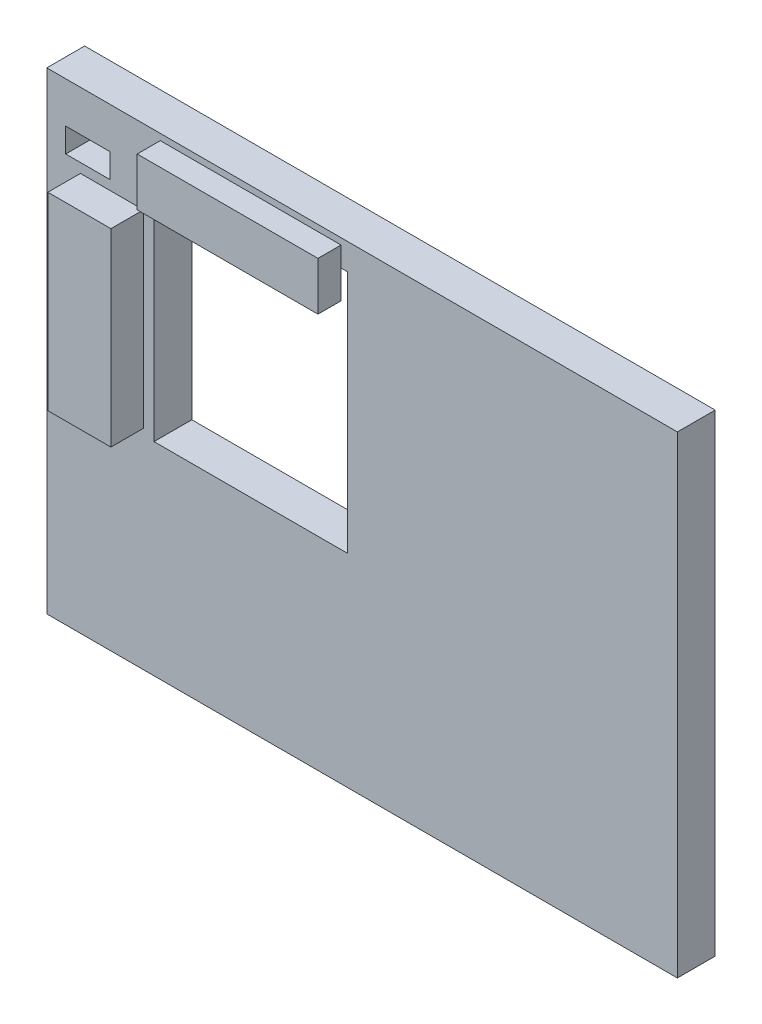
ISO-10303-21;
HEADER;
FILE_DESCRIPTION(('STEP AP214'),'2;1');
FILE_NAME('part.step','',(''),(''),'','','');
FILE_SCHEMA(('AUTOMOTIVE_DESIGN { 1 0 10303 214 1 1 1 1 }'));
ENDSEC;
DATA;
#1=APPLICATION_CONTEXT('core data for automotive mechanical design processes');
#2=APPLICATION_PROTOCOL_DEFINITION('international standard','automotive_design',2000,#1);
#3=PRODUCT_CONTEXT('',#1,'mechanical');
#4=PRODUCT('Part','Part','',(#3));
#5=PRODUCT_RELATED_PRODUCT_CATEGORY('part','',(#4));
#6=PRODUCT_DEFINITION_FORMATION('','',#4);
#7=PRODUCT_DEFINITION_CONTEXT('part definition',#1,'design');
#8=PRODUCT_DEFINITION('design','',#6,#7);
#9=PRODUCT_DEFINITION_SHAPE('','',#8);
#10=(LENGTH_UNIT() NAMED_UNIT(*) SI_UNIT(.MILLI.,.METRE.));
#11=(NAMED_UNIT(*) PLANE_ANGLE_UNIT() SI_UNIT($,.RADIAN.));
#12=(NAMED_UNIT(*) SI_UNIT($,.STERADIAN.) SOLID_ANGLE_UNIT());
#13=UNCERTAINTY_MEASURE_WITH_UNIT(LENGTH_MEASURE(1.E-05),#10,'distance_accuracy_value','');
#14=(GEOMETRIC_REPRESENTATION_CONTEXT(3) GLOBAL_UNCERTAINTY_ASSIGNED_CONTEXT((#13)) GLOBAL_UNIT_ASSIGNED_CONTEXT((#10,
#11,#12)) REPRESENTATION_CONTEXT('',''));
#15=CARTESIAN_POINT('',(0.,0.,0.));
#16=DIRECTION('',(0.,0.,1.));
#17=DIRECTION('',(1.,0.,0.));
#18=AXIS2_PLACEMENT_3D('',#15,#16,#17);
#19=CARTESIAN_POINT('',(0.,0.,180.));
#20=DIRECTION('',(0.,0.,1.));
#21=DIRECTION('',(1.,0.,0.));
#22=AXIS2_PLACEMENT_3D('',#19,#20,#21);
#23=PLANE('',#22);
#24=DIRECTION('',(1.,0.,0.));
#25=VECTOR('',#24,1.);
#26=CARTESIAN_POINT('',(-1273.2931930531,-480.28053956643,180.));
#27=LINE('',#26,#25);
#28=CARTESIAN_POINT('',(-1273.2931930531,-480.28053956643,180.));
#29=VERTEX_POINT('',#28);
#30=CARTESIAN_POINT('',(-973.293193053099,-480.28053956643,180.));
#31=VERTEX_POINT('',#30);
#32=EDGE_CURVE('E203',#29,#31,#27,.T.);
#33=ORIENTED_EDGE('',*,*,#32,.F.);
#34=DIRECTION('',(0.,-1.,0.));
#35=VECTOR('',#34,1.);
#36=CARTESIAN_POINT('',(-1273.2931930531,419.71946043357,180.));
#37=LINE('',#36,#35);
#38=CARTESIAN_POINT('',(-1273.2931930531,419.71946043357,180.));
#39=VERTEX_POINT('',#38);
#40=EDGE_CURVE('E200',#39,#29,#37,.T.);
#41=ORIENTED_EDGE('',*,*,#40,.F.);
#42=DIRECTION('',(-1.,0.,0.));
#43=VECTOR('',#42,1.);
#44=CARTESIAN_POINT('',(-1273.2931930531,419.71946043357,180.));
#45=LINE('',#44,#43);
#46=CARTESIAN_POINT('',(-973.293193053099,419.71946043357,180.));
#47=VERTEX_POINT('',#46);
#48=EDGE_CURVE('E213',#47,#39,#45,.T.);
#49=ORIENTED_EDGE('',*,*,#48,.F.);
#50=DIRECTION('',(0.,1.,0.));
#51=VECTOR('',#50,1.);
#52=CARTESIAN_POINT('',(-973.293193053099,419.71946043357,180.));
#53=LINE('',#52,#51);
#54=EDGE_CURVE('E221',#31,#47,#53,.T.);
#55=ORIENTED_EDGE('',*,*,#54,.F.);
#56=EDGE_LOOP('',(#33,#41,#49,#55));
#57=FACE_BOUND('',#56,.T.);
#58=DIRECTION('',(1.,0.,0.));
#59=VECTOR('',#58,1.);
#60=CARTESIAN_POINT('',(-1343.2931930531,464.71946043357,180.));
#61=LINE('',#60,#59);
#62=CARTESIAN_POINT('',(-1343.2931930531,464.71946043357,180.));
#63=VERTEX_POINT('',#62);
#64=CARTESIAN_POINT('',(-1133.2931930531,464.71946043357,180.));
#65=VERTEX_POINT('',#64);
#66=EDGE_CURVE('E269',#63,#65,#61,.T.);
#67=ORIENTED_EDGE('',*,*,#66,.F.);
#68=DIRECTION('',(0.,-1.,0.));
#69=VECTOR('',#68,1.);
#70=CARTESIAN_POINT('',(-1343.2931930531,579.71946043357,180.));
#71=LINE('',#70,#69);
#72=CARTESIAN_POINT('',(-1343.2931930531,579.71946043357,180.));
#73=VERTEX_POINT('',#72);
#74=EDGE_CURVE('E267',#73,#63,#71,.T.);
#75=ORIENTED_EDGE('',*,*,#74,.F.);
#76=DIRECTION('',(-1.,0.,0.));
#77=VECTOR('',#76,1.);
#78=CARTESIAN_POINT('',(-1343.2931930531,579.71946043357,180.));
#79=LINE('',#78,#77);
#80=CARTESIAN_POINT('',(-1133.2931930531,579.71946043357,180.));
#81=VERTEX_POINT('',#80);
#82=EDGE_CURVE('E275',#81,#73,#79,.T.);
#83=ORIENTED_EDGE('',*,*,#82,.F.);
#84=DIRECTION('',(0.,1.,0.));
#85=VECTOR('',#84,1.);
#86=CARTESIAN_POINT('',(-1133.2931930531,579.71946043357,180.));
#87=LINE('',#86,#85);
#88=EDGE_CURVE('E272',#65,#81,#87,.T.);
#89=ORIENTED_EDGE('',*,*,#88,.F.);
#90=EDGE_LOOP('',(#67,#75,#83,#89));
#91=FACE_BOUND('',#90,.T.);
#92=DIRECTION('',(0.,-1.,0.));
#93=VECTOR('',#92,1.);
#94=CARTESIAN_POINT('',(-1433.2931930531,774.71946043357,180.));
#95=LINE('',#94,#93);
#96=CARTESIAN_POINT('',(-1433.2931930531,774.71946043357,180.));
#97=VERTEX_POINT('',#96);
#98=CARTESIAN_POINT('',(-1433.2931930531,-1475.28053956643,180.));
#99=VERTEX_POINT('',#98);
#100=EDGE_CURVE('E298',#97,#99,#95,.T.);
#101=ORIENTED_EDGE('',*,*,#100,.T.);
#102=DIRECTION('',(1.,0.,0.));
#103=VECTOR('',#102,1.);
#104=CARTESIAN_POINT('',(-1433.2931930531,-1475.28053956643,180.));
#105=LINE('',#104,#103);
#106=CARTESIAN_POINT('',(1566.7068069469,-1475.28053956643,180.));
#107=VERTEX_POINT('',#106);
#108=EDGE_CURVE('E301',#99,#107,#105,.T.);
#109=ORIENTED_EDGE('',*,*,#108,.T.);
#110=DIRECTION('',(0.,1.,0.));
#111=VECTOR('',#110,1.);
#112=CARTESIAN_POINT('',(1566.7068069469,774.71946043357,180.));
#113=LINE('',#112,#111);
#114=CARTESIAN_POINT('',(1566.7068069469,774.71946043357,180.));
#115=VERTEX_POINT('',#114);
#116=EDGE_CURVE('E304',#107,#115,#113,.T.);
#117=ORIENTED_EDGE('',*,*,#116,.T.);
#118=DIRECTION('',(-1.,0.,0.));
#119=VECTOR('',#118,1.);
#120=CARTESIAN_POINT('',(-1433.2931930531,774.71946043357,180.));
#121=LINE('',#120,#119);
#122=EDGE_CURVE('E306',#115,#97,#121,.T.);
#123=ORIENTED_EDGE('',*,*,#122,.T.);
#124=EDGE_LOOP('',(#101,#109,#117,#123));
#125=FACE_BOUND('',#124,.T.);
#126=DIRECTION('',(-1.,0.,0.));
#127=VECTOR('',#126,1.);
#128=CARTESIAN_POINT('',(-923.293193053099,649.71946043357,180.));
#129=LINE('',#128,#127);
#130=CARTESIAN_POINT('',(-893.293193053099,649.71946043357,180.));
#131=VERTEX_POINT('',#130);
#132=CARTESIAN_POINT('',(-923.293193053099,649.71946043357,180.));
#133=VERTEX_POINT('',#132);
#134=EDGE_CURVE('E241',#131,#133,#129,.T.);
#135=ORIENTED_EDGE('',*,*,#134,.F.);
#136=DIRECTION('',(0.,-1.,0.));
#137=VECTOR('',#136,1.);
#138=CARTESIAN_POINT('',(-893.293193053099,744.71946043357,180.));
#139=LINE('',#138,#137);
#140=CARTESIAN_POINT('',(-893.293193053099,744.71946043357,180.));
#141=VERTEX_POINT('',#140);
#142=EDGE_CURVE('E48',#141,#131,#139,.T.);
#143=ORIENTED_EDGE('',*,*,#142,.F.);
#144=DIRECTION('',(-1.,0.,0.));
#145=VECTOR('',#144,1.);
#146=CARTESIAN_POINT('',(-893.293193053099,744.71946043357,180.));
#147=LINE('',#146,#145);
#148=CARTESIAN_POINT('',(-33.2931930530991,744.71946043357,180.));
#149=VERTEX_POINT('',#148);
#150=EDGE_CURVE('E195',#149,#141,#147,.T.);
#151=ORIENTED_EDGE('',*,*,#150,.F.);
#152=DIRECTION('',(0.,1.,0.));
#153=VECTOR('',#152,1.);
#154=CARTESIAN_POINT('',(-33.2931930530991,744.71946043357,180.));
#155=LINE('',#154,#153);
#156=CARTESIAN_POINT('',(-33.2931930530991,649.71946043357,180.));
#157=VERTEX_POINT('',#156);
#158=EDGE_CURVE('E592',#157,#149,#155,.T.);
#159=ORIENTED_EDGE('',*,*,#158,.F.);
#160=CARTESIAN_POINT('',(-3.29319305309905,649.71946043357,180.));
#161=VERTEX_POINT('',#160);
#162=EDGE_CURVE('E242',#161,#157,#129,.T.);
#163=ORIENTED_EDGE('',*,*,#162,.F.);
#164=DIRECTION('',(0.,1.,0.));
#165=VECTOR('',#164,1.);
#166=CARTESIAN_POINT('',(-3.29319305309905,649.71946043357,180.));
#167=LINE('',#166,#165);
#168=CARTESIAN_POINT('',(-3.29319305309894,-510.28053956643,180.));
#169=VERTEX_POINT('',#168);
#170=EDGE_CURVE('E238',#169,#161,#167,.T.);
#171=ORIENTED_EDGE('',*,*,#170,.F.);
#172=DIRECTION('',(1.,0.,0.));
#173=VECTOR('',#172,1.);
#174=CARTESIAN_POINT('',(-923.293193053099,-510.28053956643,180.));
#175=LINE('',#174,#173);
#176=CARTESIAN_POINT('',(-923.293193053099,-510.28053956643,180.));
#177=VERTEX_POINT('',#176);
#178=EDGE_CURVE('E235',#177,#169,#175,.T.);
#179=ORIENTED_EDGE('',*,*,#178,.F.);
#180=DIRECTION('',(0.,-1.,0.));
#181=VECTOR('',#180,1.);
#182=CARTESIAN_POINT('',(-923.293193053099,649.71946043357,180.));
#183=LINE('',#182,#181);
#184=EDGE_CURVE('E233',#133,#177,#183,.T.);
#185=ORIENTED_EDGE('',*,*,#184,.F.);
#186=EDGE_LOOP('',(#135,#143,#151,#159,#163,#171,#179,#185));
#187=FACE_BOUND('',#186,.T.);
#188=ADVANCED_FACE('F33',(#57,#91,#125,#187),#23,.T.);
#189=CARTESIAN_POINT('',(0.,0.,0.));
#190=DIRECTION('',(0.,0.,1.));
#191=DIRECTION('',(1.,0.,0.));
#192=AXIS2_PLACEMENT_3D('',#189,#190,#191);
#193=PLANE('',#192);
#194=DIRECTION('',(0.,-1.,0.));
#195=VECTOR('',#194,1.);
#196=CARTESIAN_POINT('',(-1343.2931930531,579.71946043357,0.));
#197=LINE('',#196,#195);
#198=CARTESIAN_POINT('',(-1343.2931930531,579.71946043357,0.));
#199=VERTEX_POINT('',#198);
#200=CARTESIAN_POINT('',(-1343.2931930531,464.71946043357,0.));
#201=VERTEX_POINT('',#200);
#202=EDGE_CURVE('E266',#199,#201,#197,.T.);
#203=ORIENTED_EDGE('',*,*,#202,.T.);
#204=DIRECTION('',(1.,0.,0.));
#205=VECTOR('',#204,1.);
#206=CARTESIAN_POINT('',(-1343.2931930531,464.71946043357,0.));
#207=LINE('',#206,#205);
#208=CARTESIAN_POINT('',(-1133.2931930531,464.71946043357,0.));
#209=VERTEX_POINT('',#208);
#210=EDGE_CURVE('E280',#201,#209,#207,.T.);
#211=ORIENTED_EDGE('',*,*,#210,.T.);
#212=DIRECTION('',(0.,1.,0.));
#213=VECTOR('',#212,1.);
#214=CARTESIAN_POINT('',(-1133.2931930531,579.71946043357,0.));
#215=LINE('',#214,#213);
#216=CARTESIAN_POINT('',(-1133.2931930531,579.71946043357,0.));
#217=VERTEX_POINT('',#216);
#218=EDGE_CURVE('E283',#209,#217,#215,.T.);
#219=ORIENTED_EDGE('',*,*,#218,.T.);
#220=DIRECTION('',(-1.,0.,0.));
#221=VECTOR('',#220,1.);
#222=CARTESIAN_POINT('',(-1343.2931930531,579.71946043357,0.));
#223=LINE('',#222,#221);
#224=EDGE_CURVE('E270',#217,#199,#223,.T.);
#225=ORIENTED_EDGE('',*,*,#224,.T.);
#226=EDGE_LOOP('',(#203,#211,#219,#225));
#227=FACE_BOUND('',#226,.T.);
#228=DIRECTION('',(0.,-1.,0.));
#229=VECTOR('',#228,1.);
#230=CARTESIAN_POINT('',(-1433.2931930531,774.71946043357,0.));
#231=LINE('',#230,#229);
#232=CARTESIAN_POINT('',(-1433.2931930531,774.71946043357,0.));
#233=VERTEX_POINT('',#232);
#234=CARTESIAN_POINT('',(-1433.2931930531,-1475.28053956643,0.));
#235=VERTEX_POINT('',#234);
#236=EDGE_CURVE('E297',#233,#235,#231,.T.);
#237=ORIENTED_EDGE('',*,*,#236,.F.);
#238=DIRECTION('',(-1.,0.,0.));
#239=VECTOR('',#238,1.);
#240=CARTESIAN_POINT('',(-1433.2931930531,774.71946043357,0.));
#241=LINE('',#240,#239);
#242=CARTESIAN_POINT('',(1566.7068069469,774.71946043357,0.));
#243=VERTEX_POINT('',#242);
#244=EDGE_CURVE('E302',#243,#233,#241,.T.);
#245=ORIENTED_EDGE('',*,*,#244,.F.);
#246=DIRECTION('',(0.,1.,0.));
#247=VECTOR('',#246,1.);
#248=CARTESIAN_POINT('',(1566.7068069469,774.71946043357,0.));
#249=LINE('',#248,#247);
#250=CARTESIAN_POINT('',(1566.7068069469,-1475.28053956643,0.));
#251=VERTEX_POINT('',#250);
#252=EDGE_CURVE('E313',#251,#243,#249,.T.);
#253=ORIENTED_EDGE('',*,*,#252,.F.);
#254=DIRECTION('',(1.,0.,0.));
#255=VECTOR('',#254,1.);
#256=CARTESIAN_POINT('',(-1433.2931930531,-1475.28053956643,0.));
#257=LINE('',#256,#255);
#258=EDGE_CURVE('E311',#235,#251,#257,.T.);
#259=ORIENTED_EDGE('',*,*,#258,.F.);
#260=EDGE_LOOP('',(#237,#245,#253,#259));
#261=FACE_BOUND('',#260,.T.);
#262=DIRECTION('',(0.,-1.,0.));
#263=VECTOR('',#262,1.);
#264=CARTESIAN_POINT('',(-923.293193053099,649.71946043357,0.));
#265=LINE('',#264,#263);
#266=CARTESIAN_POINT('',(-923.293193053099,649.71946043357,0.));
#267=VERTEX_POINT('',#266);
#268=CARTESIAN_POINT('',(-923.293193053099,-510.28053956643,0.));
#269=VERTEX_POINT('',#268);
#270=EDGE_CURVE('E232',#267,#269,#265,.T.);
#271=ORIENTED_EDGE('',*,*,#270,.T.);
#272=DIRECTION('',(1.,0.,0.));
#273=VECTOR('',#272,1.);
#274=CARTESIAN_POINT('',(-923.293193053099,-510.28053956643,0.));
#275=LINE('',#274,#273);
#276=CARTESIAN_POINT('',(-3.29319305309894,-510.28053956643,0.));
#277=VERTEX_POINT('',#276);
#278=EDGE_CURVE('E249',#269,#277,#275,.T.);
#279=ORIENTED_EDGE('',*,*,#278,.T.);
#280=DIRECTION('',(0.,1.,0.));
#281=VECTOR('',#280,1.);
#282=CARTESIAN_POINT('',(-3.29319305309905,649.71946043357,0.));
#283=LINE('',#282,#281);
#284=CARTESIAN_POINT('',(-3.29319305309905,649.71946043357,0.));
#285=VERTEX_POINT('',#284);
#286=EDGE_CURVE('E252',#277,#285,#283,.T.);
#287=ORIENTED_EDGE('',*,*,#286,.T.);
#288=DIRECTION('',(-1.,0.,0.));
#289=VECTOR('',#288,1.);
#290=CARTESIAN_POINT('',(-923.293193053099,649.71946043357,0.));
#291=LINE('',#290,#289);
#292=EDGE_CURVE('E236',#285,#267,#291,.T.);
#293=ORIENTED_EDGE('',*,*,#292,.T.);
#294=EDGE_LOOP('',(#271,#279,#287,#293));
#295=FACE_BOUND('',#294,.T.);
#296=ADVANCED_FACE('F331',(#227,#261,#295),#193,.F.);
#297=CARTESIAN_POINT('',(-1433.2931930531,774.71946043357,180.));
#298=DIRECTION('',(1.,0.,0.));
#299=DIRECTION('',(0.,1.,0.));
#300=AXIS2_PLACEMENT_3D('',#297,#298,#299);
#301=PLANE('',#300);
#302=ORIENTED_EDGE('',*,*,#236,.T.);
#303=DIRECTION('',(0.,0.,-1.));
#304=VECTOR('',#303,1.);
#305=CARTESIAN_POINT('',(-1433.2931930531,-1475.28053956643,180.));
#306=LINE('',#305,#304);
#307=EDGE_CURVE('E11',#99,#235,#306,.T.);
#308=ORIENTED_EDGE('',*,*,#307,.F.);
#309=ORIENTED_EDGE('',*,*,#100,.F.);
#310=DIRECTION('',(0.,0.,-1.));
#311=VECTOR('',#310,1.);
#312=CARTESIAN_POINT('',(-1433.2931930531,774.71946043357,180.));
#313=LINE('',#312,#311);
#314=EDGE_CURVE('E308',#97,#233,#313,.T.);
#315=ORIENTED_EDGE('',*,*,#314,.T.);
#316=EDGE_LOOP('',(#302,#308,#309,#315));
#317=FACE_BOUND('',#316,.T.);
#318=ADVANCED_FACE('F35',(#317),#301,.F.);
#319=CARTESIAN_POINT('',(-1433.2931930531,-1475.28053956643,180.));
#320=DIRECTION('',(0.,1.,0.));
#321=DIRECTION('',(0.,0.,1.));
#322=AXIS2_PLACEMENT_3D('',#319,#320,#321);
#323=PLANE('',#322);
#324=ORIENTED_EDGE('',*,*,#258,.T.);
#325=DIRECTION('',(0.,0.,-1.));
#326=VECTOR('',#325,1.);
#327=CARTESIAN_POINT('',(1566.7068069469,-1475.28053956643,180.));
#328=LINE('',#327,#326);
#329=EDGE_CURVE('E41',#107,#251,#328,.T.);
#330=ORIENTED_EDGE('',*,*,#329,.F.);
#331=ORIENTED_EDGE('',*,*,#108,.F.);
#332=ORIENTED_EDGE('',*,*,#307,.T.);
#333=EDGE_LOOP('',(#324,#330,#331,#332));
#334=FACE_BOUND('',#333,.T.);
#335=ADVANCED_FACE('F342',(#334),#323,.F.);
#336=CARTESIAN_POINT('',(1566.7068069469,774.71946043357,180.));
#337=DIRECTION('',(-1.,0.,0.));
#338=DIRECTION('',(0.,-1.,0.));
#339=AXIS2_PLACEMENT_3D('',#336,#337,#338);
#340=PLANE('',#339);
#341=ORIENTED_EDGE('',*,*,#252,.T.);
#342=DIRECTION('',(0.,0.,-1.));
#343=VECTOR('',#342,1.);
#344=CARTESIAN_POINT('',(1566.7068069469,774.71946043357,180.));
#345=LINE('',#344,#343);
#346=EDGE_CURVE('E318',#115,#243,#345,.T.);
#347=ORIENTED_EDGE('',*,*,#346,.F.);
#348=ORIENTED_EDGE('',*,*,#116,.F.);
#349=ORIENTED_EDGE('',*,*,#329,.T.);
#350=EDGE_LOOP('',(#341,#347,#348,#349));
#351=FACE_BOUND('',#350,.T.);
#352=ADVANCED_FACE('F325',(#351),#340,.F.);
#353=CARTESIAN_POINT('',(-1433.2931930531,774.71946043357,180.));
#354=DIRECTION('',(0.,-1.,0.));
#355=DIRECTION('',(1.,0.,0.));
#356=AXIS2_PLACEMENT_3D('',#353,#354,#355);
#357=PLANE('',#356);
#358=ORIENTED_EDGE('',*,*,#244,.T.);
#359=ORIENTED_EDGE('',*,*,#314,.F.);
#360=ORIENTED_EDGE('',*,*,#122,.F.);
#361=ORIENTED_EDGE('',*,*,#346,.T.);
#362=EDGE_LOOP('',(#358,#359,#360,#361));
#363=FACE_BOUND('',#362,.T.);
#364=ADVANCED_FACE('F335',(#363),#357,.F.);
#365=CARTESIAN_POINT('',(-1343.2931930531,579.71946043357,180.));
#366=DIRECTION('',(1.,0.,0.));
#367=DIRECTION('',(0.,0.,-1.));
#368=AXIS2_PLACEMENT_3D('',#365,#366,#367);
#369=PLANE('',#368);
#370=ORIENTED_EDGE('',*,*,#202,.F.);
#371=DIRECTION('',(0.,0.,-1.));
#372=VECTOR('',#371,1.);
#373=CARTESIAN_POINT('',(-1343.2931930531,579.71946043357,180.));
#374=LINE('',#373,#372);
#375=EDGE_CURVE('E277',#73,#199,#374,.T.);
#376=ORIENTED_EDGE('',*,*,#375,.F.);
#377=ORIENTED_EDGE('',*,*,#74,.T.);
#378=DIRECTION('',(0.,0.,-1.));
#379=VECTOR('',#378,1.);
#380=CARTESIAN_POINT('',(-1343.2931930531,464.71946043357,180.));
#381=LINE('',#380,#379);
#382=EDGE_CURVE('E294',#63,#201,#381,.T.);
#383=ORIENTED_EDGE('',*,*,#382,.T.);
#384=EDGE_LOOP('',(#370,#376,#377,#383));
#385=FACE_BOUND('',#384,.T.);
#386=ADVANCED_FACE('F360',(#385),#369,.T.);
#387=CARTESIAN_POINT('',(-1343.2931930531,464.71946043357,180.));
#388=DIRECTION('',(0.,1.,0.));
#389=DIRECTION('',(0.,0.,1.));
#390=AXIS2_PLACEMENT_3D('',#387,#388,#389);
#391=PLANE('',#390);
#392=ORIENTED_EDGE('',*,*,#210,.F.);
#393=ORIENTED_EDGE('',*,*,#382,.F.);
#394=ORIENTED_EDGE('',*,*,#66,.T.);
#395=DIRECTION('',(0.,0.,-1.));
#396=VECTOR('',#395,1.);
#397=CARTESIAN_POINT('',(-1133.2931930531,464.71946043357,180.));
#398=LINE('',#397,#396);
#399=EDGE_CURVE('E292',#65,#209,#398,.T.);
#400=ORIENTED_EDGE('',*,*,#399,.T.);
#401=EDGE_LOOP('',(#392,#393,#394,#400));
#402=FACE_BOUND('',#401,.T.);
#403=ADVANCED_FACE('F367',(#402),#391,.T.);
#404=CARTESIAN_POINT('',(-1133.2931930531,579.71946043357,180.));
#405=DIRECTION('',(-1.,0.,0.));
#406=DIRECTION('',(0.,0.,1.));
#407=AXIS2_PLACEMENT_3D('',#404,#405,#406);
#408=PLANE('',#407);
#409=ORIENTED_EDGE('',*,*,#218,.F.);
#410=ORIENTED_EDGE('',*,*,#399,.F.);
#411=ORIENTED_EDGE('',*,*,#88,.T.);
#412=DIRECTION('',(0.,0.,-1.));
#413=VECTOR('',#412,1.);
#414=CARTESIAN_POINT('',(-1133.2931930531,579.71946043357,180.));
#415=LINE('',#414,#413);
#416=EDGE_CURVE('E290',#81,#217,#415,.T.);
#417=ORIENTED_EDGE('',*,*,#416,.T.);
#418=EDGE_LOOP('',(#409,#410,#411,#417));
#419=FACE_BOUND('',#418,.T.);
#420=ADVANCED_FACE('F372',(#419),#408,.T.);
#421=CARTESIAN_POINT('',(-1343.2931930531,579.71946043357,180.));
#422=DIRECTION('',(0.,-1.,0.));
#423=DIRECTION('',(0.,0.,-1.));
#424=AXIS2_PLACEMENT_3D('',#421,#422,#423);
#425=PLANE('',#424);
#426=ORIENTED_EDGE('',*,*,#224,.F.);
#427=ORIENTED_EDGE('',*,*,#416,.F.);
#428=ORIENTED_EDGE('',*,*,#82,.T.);
#429=ORIENTED_EDGE('',*,*,#375,.T.);
#430=EDGE_LOOP('',(#426,#427,#428,#429));
#431=FACE_BOUND('',#430,.T.);
#432=ADVANCED_FACE('F379',(#431),#425,.T.);
#433=CARTESIAN_POINT('',(-923.293193053099,649.71946043357,180.));
#434=DIRECTION('',(1.,0.,0.));
#435=DIRECTION('',(0.,1.,0.));
#436=AXIS2_PLACEMENT_3D('',#433,#434,#435);
#437=PLANE('',#436);
#438=ORIENTED_EDGE('',*,*,#270,.F.);
#439=DIRECTION('',(0.,0.,-1.));
#440=VECTOR('',#439,1.);
#441=CARTESIAN_POINT('',(-923.293193053099,649.71946043357,180.));
#442=LINE('',#441,#440);
#443=EDGE_CURVE('E245',#133,#267,#442,.T.);
#444=ORIENTED_EDGE('',*,*,#443,.F.);
#445=ORIENTED_EDGE('',*,*,#184,.T.);
#446=DIRECTION('',(0.,0.,-1.));
#447=VECTOR('',#446,1.);
#448=CARTESIAN_POINT('',(-923.293193053099,-510.28053956643,180.));
#449=LINE('',#448,#447);
#450=EDGE_CURVE('E263',#177,#269,#449,.T.);
#451=ORIENTED_EDGE('',*,*,#450,.T.);
#452=EDGE_LOOP('',(#438,#444,#445,#451));
#453=FACE_BOUND('',#452,.T.);
#454=ADVANCED_FACE('F391',(#453),#437,.T.);
#455=CARTESIAN_POINT('',(-923.293193053099,-510.28053956643,180.));
#456=DIRECTION('',(0.,1.,0.));
#457=DIRECTION('',(0.,0.,1.));
#458=AXIS2_PLACEMENT_3D('',#455,#456,#457);
#459=PLANE('',#458);
#460=ORIENTED_EDGE('',*,*,#278,.F.);
#461=ORIENTED_EDGE('',*,*,#450,.F.);
#462=ORIENTED_EDGE('',*,*,#178,.T.);
#463=DIRECTION('',(0.,0.,-1.));
#464=VECTOR('',#463,1.);
#465=CARTESIAN_POINT('',(-3.29319305309894,-510.28053956643,180.));
#466=LINE('',#465,#464);
#467=EDGE_CURVE('E261',#169,#277,#466,.T.);
#468=ORIENTED_EDGE('',*,*,#467,.T.);
#469=EDGE_LOOP('',(#460,#461,#462,#468));
#470=FACE_BOUND('',#469,.T.);
#471=ADVANCED_FACE('F396',(#470),#459,.T.);
#472=CARTESIAN_POINT('',(-3.29319305309905,649.71946043357,180.));
#473=DIRECTION('',(-1.,0.,0.));
#474=DIRECTION('',(0.,-1.,0.));
#475=AXIS2_PLACEMENT_3D('',#472,#473,#474);
#476=PLANE('',#475);
#477=ORIENTED_EDGE('',*,*,#286,.F.);
#478=ORIENTED_EDGE('',*,*,#467,.F.);
#479=ORIENTED_EDGE('',*,*,#170,.T.);
#480=DIRECTION('',(0.,0.,-1.));
#481=VECTOR('',#480,1.);
#482=CARTESIAN_POINT('',(-3.29319305309905,649.71946043357,180.));
#483=LINE('',#482,#481);
#484=EDGE_CURVE('E259',#161,#285,#483,.T.);
#485=ORIENTED_EDGE('',*,*,#484,.T.);
#486=EDGE_LOOP('',(#477,#478,#479,#485));
#487=FACE_BOUND('',#486,.T.);
#488=ADVANCED_FACE('F400',(#487),#476,.T.);
#489=CARTESIAN_POINT('',(-923.293193053099,649.71946043357,180.));
#490=DIRECTION('',(0.,-1.,0.));
#491=DIRECTION('',(0.,0.,-1.));
#492=AXIS2_PLACEMENT_3D('',#489,#490,#491);
#493=PLANE('',#492);
#494=ORIENTED_EDGE('',*,*,#292,.F.);
#495=ORIENTED_EDGE('',*,*,#484,.F.);
#496=ORIENTED_EDGE('',*,*,#162,.T.);
#497=EDGE_CURVE('E246',#157,#131,#129,.T.);
#498=ORIENTED_EDGE('',*,*,#497,.T.);
#499=ORIENTED_EDGE('',*,*,#134,.T.);
#500=ORIENTED_EDGE('',*,*,#443,.T.);
#501=EDGE_LOOP('',(#494,#495,#496,#498,#499,#500));
#502=FACE_BOUND('',#501,.T.);
#503=ADVANCED_FACE('F404',(#502),#493,.T.);
#504=CARTESIAN_POINT('',(-1273.2931930531,419.71946043357,335.));
#505=DIRECTION('',(1.,0.,0.));
#506=DIRECTION('',(0.,0.,-1.));
#507=AXIS2_PLACEMENT_3D('',#504,#505,#506);
#508=PLANE('',#507);
#509=ORIENTED_EDGE('',*,*,#40,.T.);
#510=DIRECTION('',(0.,0.,-1.));
#511=VECTOR('',#510,1.);
#512=CARTESIAN_POINT('',(-1273.2931930531,-480.28053956643,335.));
#513=LINE('',#512,#511);
#514=CARTESIAN_POINT('',(-1273.2931930531,-480.28053956643,335.));
#515=VERTEX_POINT('',#514);
#516=EDGE_CURVE('E230',#515,#29,#513,.T.);
#517=ORIENTED_EDGE('',*,*,#516,.F.);
#518=DIRECTION('',(0.,-1.,0.));
#519=VECTOR('',#518,1.);
#520=CARTESIAN_POINT('',(-1273.2931930531,419.71946043357,335.));
#521=LINE('',#520,#519);
#522=CARTESIAN_POINT('',(-1273.2931930531,419.71946043357,335.));
#523=VERTEX_POINT('',#522);
#524=EDGE_CURVE('E209',#523,#515,#521,.T.);
#525=ORIENTED_EDGE('',*,*,#524,.F.);
#526=DIRECTION('',(0.,0.,-1.));
#527=VECTOR('',#526,1.);
#528=CARTESIAN_POINT('',(-1273.2931930531,419.71946043357,335.));
#529=LINE('',#528,#527);
#530=EDGE_CURVE('E218',#523,#39,#529,.T.);
#531=ORIENTED_EDGE('',*,*,#530,.T.);
#532=EDGE_LOOP('',(#509,#517,#525,#531));
#533=FACE_BOUND('',#532,.T.);
#534=ADVANCED_FACE('F408',(#533),#508,.F.);
#535=CARTESIAN_POINT('',(-1273.2931930531,-480.28053956643,335.));
#536=DIRECTION('',(0.,1.,0.));
#537=DIRECTION('',(0.,0.,1.));
#538=AXIS2_PLACEMENT_3D('',#535,#536,#537);
#539=PLANE('',#538);
#540=ORIENTED_EDGE('',*,*,#32,.T.);
#541=DIRECTION('',(0.,0.,-1.));
#542=VECTOR('',#541,1.);
#543=CARTESIAN_POINT('',(-973.293193053099,-480.28053956643,335.));
#544=LINE('',#543,#542);
#545=CARTESIAN_POINT('',(-973.293193053099,-480.28053956643,335.));
#546=VERTEX_POINT('',#545);
#547=EDGE_CURVE('E227',#546,#31,#544,.T.);
#548=ORIENTED_EDGE('',*,*,#547,.F.);
#549=DIRECTION('',(1.,0.,0.));
#550=VECTOR('',#549,1.);
#551=CARTESIAN_POINT('',(-1273.2931930531,-480.28053956643,335.));
#552=LINE('',#551,#550);
#553=EDGE_CURVE('E212',#515,#546,#552,.T.);
#554=ORIENTED_EDGE('',*,*,#553,.F.);
#555=ORIENTED_EDGE('',*,*,#516,.T.);
#556=EDGE_LOOP('',(#540,#548,#554,#555));
#557=FACE_BOUND('',#556,.T.);
#558=ADVANCED_FACE('F412',(#557),#539,.F.);
#559=CARTESIAN_POINT('',(-973.293193053099,419.71946043357,335.));
#560=DIRECTION('',(-1.,0.,0.));
#561=DIRECTION('',(0.,-1.,0.));
#562=AXIS2_PLACEMENT_3D('',#559,#560,#561);
#563=PLANE('',#562);
#564=ORIENTED_EDGE('',*,*,#54,.T.);
#565=DIRECTION('',(0.,0.,-1.));
#566=VECTOR('',#565,1.);
#567=CARTESIAN_POINT('',(-973.293193053099,419.71946043357,335.));
#568=LINE('',#567,#566);
#569=CARTESIAN_POINT('',(-973.293193053099,419.71946043357,335.));
#570=VERTEX_POINT('',#569);
#571=EDGE_CURVE('E56',#570,#47,#568,.T.);
#572=ORIENTED_EDGE('',*,*,#571,.F.);
#573=DIRECTION('',(0.,1.,0.));
#574=VECTOR('',#573,1.);
#575=CARTESIAN_POINT('',(-973.293193053099,419.71946043357,335.));
#576=LINE('',#575,#574);
#577=EDGE_CURVE('E215',#546,#570,#576,.T.);
#578=ORIENTED_EDGE('',*,*,#577,.F.);
#579=ORIENTED_EDGE('',*,*,#547,.T.);
#580=EDGE_LOOP('',(#564,#572,#578,#579));
#581=FACE_BOUND('',#580,.T.);
#582=ADVANCED_FACE('F416',(#581),#563,.F.);
#583=CARTESIAN_POINT('',(-1273.2931930531,419.71946043357,335.));
#584=DIRECTION('',(0.,-1.,0.));
#585=DIRECTION('',(0.,0.,-1.));
#586=AXIS2_PLACEMENT_3D('',#583,#584,#585);
#587=PLANE('',#586);
#588=ORIENTED_EDGE('',*,*,#48,.T.);
#589=ORIENTED_EDGE('',*,*,#530,.F.);
#590=DIRECTION('',(-1.,0.,0.));
#591=VECTOR('',#590,1.);
#592=CARTESIAN_POINT('',(-1273.2931930531,419.71946043357,335.));
#593=LINE('',#592,#591);
#594=EDGE_CURVE('E217',#570,#523,#593,.T.);
#595=ORIENTED_EDGE('',*,*,#594,.F.);
#596=ORIENTED_EDGE('',*,*,#571,.T.);
#597=EDGE_LOOP('',(#588,#589,#595,#596));
#598=FACE_BOUND('',#597,.T.);
#599=ADVANCED_FACE('F420',(#598),#587,.F.);
#600=CARTESIAN_POINT('',(0.,0.,335.));
#601=DIRECTION('',(0.,0.,1.));
#602=DIRECTION('',(1.,0.,0.));
#603=AXIS2_PLACEMENT_3D('',#600,#601,#602);
#604=PLANE('',#603);
#605=ORIENTED_EDGE('',*,*,#524,.T.);
#606=ORIENTED_EDGE('',*,*,#553,.T.);
#607=ORIENTED_EDGE('',*,*,#577,.T.);
#608=ORIENTED_EDGE('',*,*,#594,.T.);
#609=EDGE_LOOP('',(#605,#606,#607,#608));
#610=FACE_BOUND('',#609,.T.);
#611=ADVANCED_FACE('F424',(#610),#604,.T.);
#612=CARTESIAN_POINT('',(-893.293193053099,744.71946043357,290.));
#613=DIRECTION('',(1.,0.,0.));
#614=DIRECTION('',(0.,0.,-1.));
#615=AXIS2_PLACEMENT_3D('',#612,#613,#614);
#616=PLANE('',#615);
#617=ORIENTED_EDGE('',*,*,#142,.T.);
#618=CARTESIAN_POINT('',(-893.293193053099,514.71946043357,180.));
#619=VERTEX_POINT('',#618);
#620=EDGE_CURVE('E198',#131,#619,#139,.T.);
#621=ORIENTED_EDGE('',*,*,#620,.T.);
#622=DIRECTION('',(0.,0.,-1.));
#623=VECTOR('',#622,1.);
#624=CARTESIAN_POINT('',(-893.293193053099,514.71946043357,290.));
#625=LINE('',#624,#623);
#626=CARTESIAN_POINT('',(-893.293193053099,514.71946043357,290.));
#627=VERTEX_POINT('',#626);
#628=EDGE_CURVE('E182',#627,#619,#625,.T.);
#629=ORIENTED_EDGE('',*,*,#628,.F.);
#630=DIRECTION('',(0.,-1.,0.));
#631=VECTOR('',#630,1.);
#632=CARTESIAN_POINT('',(-893.293193053099,744.71946043357,290.));
#633=LINE('',#632,#631);
#634=CARTESIAN_POINT('',(-893.293193053099,744.71946043357,290.));
#635=VERTEX_POINT('',#634);
#636=EDGE_CURVE('E188',#635,#627,#633,.T.);
#637=ORIENTED_EDGE('',*,*,#636,.F.);
#638=DIRECTION('',(0.,0.,-1.));
#639=VECTOR('',#638,1.);
#640=CARTESIAN_POINT('',(-893.293193053099,744.71946043357,290.));
#641=LINE('',#640,#639);
#642=EDGE_CURVE('E612',#635,#141,#641,.T.);
#643=ORIENTED_EDGE('',*,*,#642,.T.);
#644=EDGE_LOOP('',(#617,#621,#629,#637,#643));
#645=FACE_BOUND('',#644,.T.);
#646=ADVANCED_FACE('F197',(#645),#616,.F.);
#647=CARTESIAN_POINT('',(-893.293193053099,514.71946043357,290.));
#648=DIRECTION('',(0.,1.,0.));
#649=DIRECTION('',(0.,0.,1.));
#650=AXIS2_PLACEMENT_3D('',#647,#648,#649);
#651=PLANE('',#650);
#652=DIRECTION('',(1.,0.,0.));
#653=VECTOR('',#652,1.);
#654=CARTESIAN_POINT('',(-893.293193053099,514.71946043357,180.));
#655=LINE('',#654,#653);
#656=CARTESIAN_POINT('',(-33.2931930530991,514.71946043357,180.));
#657=VERTEX_POINT('',#656);
#658=EDGE_CURVE('E598',#619,#657,#655,.T.);
#659=ORIENTED_EDGE('',*,*,#658,.T.);
#660=DIRECTION('',(0.,0.,-1.));
#661=VECTOR('',#660,1.);
#662=CARTESIAN_POINT('',(-33.2931930530991,514.71946043357,290.));
#663=LINE('',#662,#661);
#664=CARTESIAN_POINT('',(-33.2931930530991,514.71946043357,290.));
#665=VERTEX_POINT('',#664);
#666=EDGE_CURVE('E184',#665,#657,#663,.T.);
#667=ORIENTED_EDGE('',*,*,#666,.F.);
#668=DIRECTION('',(1.,0.,0.));
#669=VECTOR('',#668,1.);
#670=CARTESIAN_POINT('',(-893.293193053099,514.71946043357,290.));
#671=LINE('',#670,#669);
#672=EDGE_CURVE('E178',#627,#665,#671,.T.);
#673=ORIENTED_EDGE('',*,*,#672,.F.);
#674=ORIENTED_EDGE('',*,*,#628,.T.);
#675=EDGE_LOOP('',(#659,#667,#673,#674));
#676=FACE_BOUND('',#675,.T.);
#677=ADVANCED_FACE('F180',(#676),#651,.F.);
#678=CARTESIAN_POINT('',(-33.2931930530991,744.71946043357,290.));
#679=DIRECTION('',(-1.,0.,0.));
#680=DIRECTION('',(0.,-1.,0.));
#681=AXIS2_PLACEMENT_3D('',#678,#679,#680);
#682=PLANE('',#681);
#683=EDGE_CURVE('E588',#657,#157,#155,.T.);
#684=ORIENTED_EDGE('',*,*,#683,.T.);
#685=ORIENTED_EDGE('',*,*,#158,.T.);
#686=DIRECTION('',(0.,0.,-1.));
#687=VECTOR('',#686,1.);
#688=CARTESIAN_POINT('',(-33.2931930530991,744.71946043357,290.));
#689=LINE('',#688,#687);
#690=CARTESIAN_POINT('',(-33.2931930530991,744.71946043357,290.));
#691=VERTEX_POINT('',#690);
#692=EDGE_CURVE('E205',#691,#149,#689,.T.);
#693=ORIENTED_EDGE('',*,*,#692,.F.);
#694=DIRECTION('',(0.,1.,0.));
#695=VECTOR('',#694,1.);
#696=CARTESIAN_POINT('',(-33.2931930530991,744.71946043357,290.));
#697=LINE('',#696,#695);
#698=EDGE_CURVE('E187',#665,#691,#697,.T.);
#699=ORIENTED_EDGE('',*,*,#698,.F.);
#700=ORIENTED_EDGE('',*,*,#666,.T.);
#701=EDGE_LOOP('',(#684,#685,#693,#699,#700));
#702=FACE_BOUND('',#701,.T.);
#703=ADVANCED_FACE('F432',(#702),#682,.F.);
#704=CARTESIAN_POINT('',(-893.293193053099,744.71946043357,290.));
#705=DIRECTION('',(0.,-1.,0.));
#706=DIRECTION('',(0.,0.,-1.));
#707=AXIS2_PLACEMENT_3D('',#704,#705,#706);
#708=PLANE('',#707);
#709=ORIENTED_EDGE('',*,*,#150,.T.);
#710=ORIENTED_EDGE('',*,*,#642,.F.);
#711=DIRECTION('',(-1.,0.,0.));
#712=VECTOR('',#711,1.);
#713=CARTESIAN_POINT('',(-893.293193053099,744.71946043357,290.));
#714=LINE('',#713,#712);
#715=EDGE_CURVE('E193',#691,#635,#714,.T.);
#716=ORIENTED_EDGE('',*,*,#715,.F.);
#717=ORIENTED_EDGE('',*,*,#692,.T.);
#718=EDGE_LOOP('',(#709,#710,#716,#717));
#719=FACE_BOUND('',#718,.T.);
#720=ADVANCED_FACE('F435',(#719),#708,.F.);
#721=CARTESIAN_POINT('',(0.,0.,290.));
#722=DIRECTION('',(0.,0.,1.));
#723=DIRECTION('',(1.,0.,0.));
#724=AXIS2_PLACEMENT_3D('',#721,#722,#723);
#725=PLANE('',#724);
#726=ORIENTED_EDGE('',*,*,#636,.T.);
#727=ORIENTED_EDGE('',*,*,#672,.T.);
#728=ORIENTED_EDGE('',*,*,#698,.T.);
#729=ORIENTED_EDGE('',*,*,#715,.T.);
#730=EDGE_LOOP('',(#726,#727,#728,#729));
#731=FACE_BOUND('',#730,.T.);
#732=ADVANCED_FACE('F191',(#731),#725,.T.);
#733=CARTESIAN_POINT('',(0.,0.,180.));
#734=DIRECTION('',(0.,0.,1.));
#735=DIRECTION('',(1.,0.,0.));
#736=AXIS2_PLACEMENT_3D('',#733,#734,#735);
#737=PLANE('',#736);
#738=ORIENTED_EDGE('',*,*,#497,.F.);
#739=ORIENTED_EDGE('',*,*,#683,.F.);
#740=ORIENTED_EDGE('',*,*,#658,.F.);
#741=ORIENTED_EDGE('',*,*,#620,.F.);
#742=EDGE_LOOP('',(#738,#739,#740,#741));
#743=FACE_BOUND('',#742,.T.);
#744=ADVANCED_FACE('F440',(#743),#737,.F.);
#745=CLOSED_SHELL('',(#188,#296,#318,#335,#352,#364,#386,#403,#420,#432,#454,#471,#488,#503,
#534,#558,#582,#599,#611,#646,#677,#703,#720,#732,#744));
#746=MANIFOLD_SOLID_BREP('B2',#745);
#747=ADVANCED_BREP_SHAPE_REPRESENTATION('',(#18,#746),#14);
#748=SHAPE_DEFINITION_REPRESENTATION(#9,#747);
ENDSEC;
END-ISO-10303-21;
